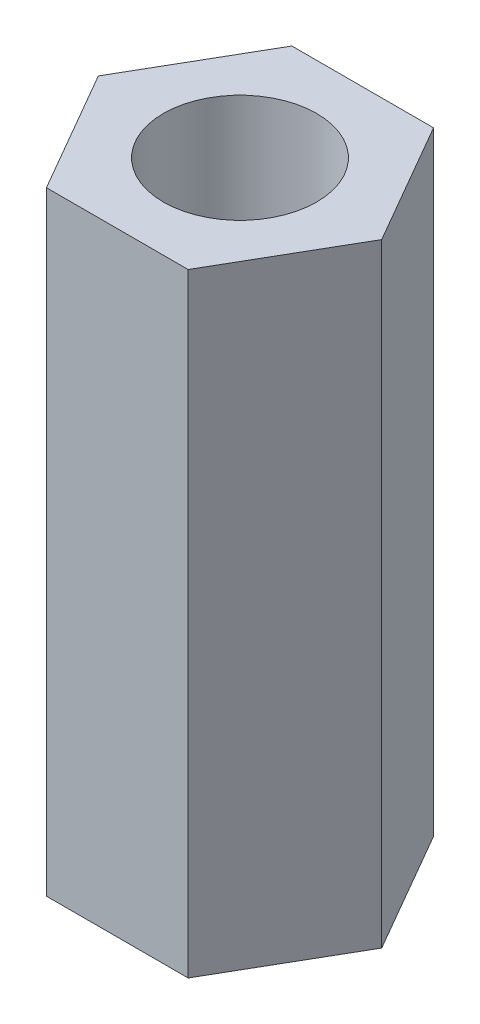
ISO-10303-21;
HEADER;
FILE_DESCRIPTION(('STEP AP214'),'2;1');
FILE_NAME('part.step','',(''),(''),'','','');
FILE_SCHEMA(('AUTOMOTIVE_DESIGN { 1 0 10303 214 1 1 1 1 }'));
ENDSEC;
DATA;
#1=APPLICATION_CONTEXT('core data for automotive mechanical design processes');
#2=APPLICATION_PROTOCOL_DEFINITION('international standard','automotive_design',2000,#1);
#3=PRODUCT_CONTEXT('',#1,'mechanical');
#4=PRODUCT('Part','Part','',(#3));
#5=PRODUCT_RELATED_PRODUCT_CATEGORY('part','',(#4));
#6=PRODUCT_DEFINITION_FORMATION('','',#4);
#7=PRODUCT_DEFINITION_CONTEXT('part definition',#1,'design');
#8=PRODUCT_DEFINITION('design','',#6,#7);
#9=PRODUCT_DEFINITION_SHAPE('','',#8);
#10=(LENGTH_UNIT() NAMED_UNIT(*) SI_UNIT(.MILLI.,.METRE.));
#11=(NAMED_UNIT(*) PLANE_ANGLE_UNIT() SI_UNIT($,.RADIAN.));
#12=(NAMED_UNIT(*) SI_UNIT($,.STERADIAN.) SOLID_ANGLE_UNIT());
#13=UNCERTAINTY_MEASURE_WITH_UNIT(LENGTH_MEASURE(1.E-05),#10,'distance_accuracy_value','');
#14=(GEOMETRIC_REPRESENTATION_CONTEXT(3) GLOBAL_UNCERTAINTY_ASSIGNED_CONTEXT((#13)) GLOBAL_UNIT_ASSIGNED_CONTEXT((#10,
#11,#12)) REPRESENTATION_CONTEXT('',''));
#15=CARTESIAN_POINT('',(0.,0.,0.));
#16=DIRECTION('',(0.,0.,1.));
#17=DIRECTION('',(1.,0.,0.));
#18=AXIS2_PLACEMENT_3D('',#15,#16,#17);
#19=CARTESIAN_POINT('',(1.15470053837928,10.,1.99999999999999));
#20=DIRECTION('',(-0.866025403784442,0.,-0.499999999999995));
#21=DIRECTION('',(-0.499999999999995,0.,0.866025403784442));
#22=AXIS2_PLACEMENT_3D('',#19,#20,#21);
#23=PLANE('',#22);
#24=DIRECTION('',(0.499999999999995,0.,-0.866025403784442));
#25=VECTOR('',#24,1.);
#26=CARTESIAN_POINT('',(1.15470053837928,0.,1.99999999999999));
#27=LINE('',#26,#25);
#28=CARTESIAN_POINT('',(1.15470053837928,0.,1.99999999999999));
#29=VERTEX_POINT('',#28);
#30=CARTESIAN_POINT('',(2.3094010767585,0.,0.));
#31=VERTEX_POINT('',#30);
#32=EDGE_CURVE('E123',#29,#31,#27,.T.);
#33=ORIENTED_EDGE('',*,*,#32,.T.);
#34=DIRECTION('',(0.,-1.,0.));
#35=VECTOR('',#34,1.);
#36=CARTESIAN_POINT('',(2.3094010767585,10.,0.));
#37=LINE('',#36,#35);
#38=CARTESIAN_POINT('',(2.3094010767585,10.,0.));
#39=VERTEX_POINT('',#38);
#40=EDGE_CURVE('E11',#39,#31,#37,.T.);
#41=ORIENTED_EDGE('',*,*,#40,.F.);
#42=DIRECTION('',(0.499999999999995,0.,-0.866025403784442));
#43=VECTOR('',#42,1.);
#44=CARTESIAN_POINT('',(1.15470053837928,10.,1.99999999999999));
#45=LINE('',#44,#43);
#46=CARTESIAN_POINT('',(1.15470053837928,10.,1.99999999999999));
#47=VERTEX_POINT('',#46);
#48=EDGE_CURVE('E134',#47,#39,#45,.T.);
#49=ORIENTED_EDGE('',*,*,#48,.F.);
#50=DIRECTION('',(0.,-1.,0.));
#51=VECTOR('',#50,1.);
#52=CARTESIAN_POINT('',(1.15470053837928,10.,1.99999999999999));
#53=LINE('',#52,#51);
#54=EDGE_CURVE('E119',#47,#29,#53,.T.);
#55=ORIENTED_EDGE('',*,*,#54,.T.);
#56=EDGE_LOOP('',(#33,#41,#49,#55));
#57=FACE_BOUND('',#56,.T.);
#58=ADVANCED_FACE('F39',(#57),#23,.F.);
#59=CARTESIAN_POINT('',(2.3094010767585,10.,0.));
#60=DIRECTION('',(-0.866025403784438,0.,0.500000000000001));
#61=DIRECTION('',(0.500000000000001,0.,0.866025403784438));
#62=AXIS2_PLACEMENT_3D('',#59,#60,#61);
#63=PLANE('',#62);
#64=DIRECTION('',(-0.500000000000001,0.,-0.866025403784438));
#65=VECTOR('',#64,1.);
#66=CARTESIAN_POINT('',(2.3094010767585,0.,0.));
#67=LINE('',#66,#65);
#68=CARTESIAN_POINT('',(1.15470053837925,0.,-2.));
#69=VERTEX_POINT('',#68);
#70=EDGE_CURVE('E126',#31,#69,#67,.T.);
#71=ORIENTED_EDGE('',*,*,#70,.T.);
#72=DIRECTION('',(0.,-1.,0.));
#73=VECTOR('',#72,1.);
#74=CARTESIAN_POINT('',(1.15470053837925,10.,-2.));
#75=LINE('',#74,#73);
#76=CARTESIAN_POINT('',(1.15470053837925,10.,-2.));
#77=VERTEX_POINT('',#76);
#78=EDGE_CURVE('E47',#77,#69,#75,.T.);
#79=ORIENTED_EDGE('',*,*,#78,.F.);
#80=DIRECTION('',(-0.500000000000001,0.,-0.866025403784438));
#81=VECTOR('',#80,1.);
#82=CARTESIAN_POINT('',(2.3094010767585,10.,0.));
#83=LINE('',#82,#81);
#84=EDGE_CURVE('E92',#39,#77,#83,.T.);
#85=ORIENTED_EDGE('',*,*,#84,.F.);
#86=ORIENTED_EDGE('',*,*,#40,.T.);
#87=EDGE_LOOP('',(#71,#79,#85,#86));
#88=FACE_BOUND('',#87,.T.);
#89=ADVANCED_FACE('F159',(#88),#63,.F.);
#90=CARTESIAN_POINT('',(1.15470053837925,10.,-2.));
#91=DIRECTION('',(0.,0.,1.));
#92=DIRECTION('',(1.,0.,0.));
#93=AXIS2_PLACEMENT_3D('',#90,#91,#92);
#94=PLANE('',#93);
#95=DIRECTION('',(-1.,0.,0.));
#96=VECTOR('',#95,1.);
#97=CARTESIAN_POINT('',(1.15470053837925,0.,-2.));
#98=LINE('',#97,#96);
#99=CARTESIAN_POINT('',(-1.15470053837926,0.,-2.));
#100=VERTEX_POINT('',#99);
#101=EDGE_CURVE('E129',#69,#100,#98,.T.);
#102=ORIENTED_EDGE('',*,*,#101,.T.);
#103=DIRECTION('',(0.,-1.,0.));
#104=VECTOR('',#103,1.);
#105=CARTESIAN_POINT('',(-1.15470053837926,10.,-2.));
#106=LINE('',#105,#104);
#107=CARTESIAN_POINT('',(-1.15470053837926,10.,-2.));
#108=VERTEX_POINT('',#107);
#109=EDGE_CURVE('E114',#108,#100,#106,.T.);
#110=ORIENTED_EDGE('',*,*,#109,.F.);
#111=DIRECTION('',(-1.,0.,0.));
#112=VECTOR('',#111,1.);
#113=CARTESIAN_POINT('',(1.15470053837925,10.,-2.));
#114=LINE('',#113,#112);
#115=EDGE_CURVE('E105',#77,#108,#114,.T.);
#116=ORIENTED_EDGE('',*,*,#115,.F.);
#117=ORIENTED_EDGE('',*,*,#78,.T.);
#118=EDGE_LOOP('',(#102,#110,#116,#117));
#119=FACE_BOUND('',#118,.T.);
#120=ADVANCED_FACE('F140',(#119),#94,.F.);
#121=CARTESIAN_POINT('',(-1.15470053837926,10.,-2.));
#122=DIRECTION('',(0.866025403784442,0.,0.499999999999995));
#123=DIRECTION('',(0.499999999999995,0.,-0.866025403784442));
#124=AXIS2_PLACEMENT_3D('',#121,#122,#123);
#125=PLANE('',#124);
#126=DIRECTION('',(-0.499999999999995,0.,0.866025403784442));
#127=VECTOR('',#126,1.);
#128=CARTESIAN_POINT('',(-1.15470053837926,0.,-2.));
#129=LINE('',#128,#127);
#130=CARTESIAN_POINT('',(-2.3094010767585,0.,0.));
#131=VERTEX_POINT('',#130);
#132=EDGE_CURVE('E113',#100,#131,#129,.T.);
#133=ORIENTED_EDGE('',*,*,#132,.T.);
#134=DIRECTION('',(0.,-1.,0.));
#135=VECTOR('',#134,1.);
#136=CARTESIAN_POINT('',(-2.3094010767585,10.,0.));
#137=LINE('',#136,#135);
#138=CARTESIAN_POINT('',(-2.3094010767585,10.,0.));
#139=VERTEX_POINT('',#138);
#140=EDGE_CURVE('E110',#139,#131,#137,.T.);
#141=ORIENTED_EDGE('',*,*,#140,.F.);
#142=DIRECTION('',(-0.499999999999995,0.,0.866025403784442));
#143=VECTOR('',#142,1.);
#144=CARTESIAN_POINT('',(-1.15470053837926,10.,-2.));
#145=LINE('',#144,#143);
#146=EDGE_CURVE('E99',#108,#139,#145,.T.);
#147=ORIENTED_EDGE('',*,*,#146,.F.);
#148=ORIENTED_EDGE('',*,*,#109,.T.);
#149=EDGE_LOOP('',(#133,#141,#147,#148));
#150=FACE_BOUND('',#149,.T.);
#151=ADVANCED_FACE('F111',(#150),#125,.F.);
#152=CARTESIAN_POINT('',(-2.3094010767585,10.,0.));
#153=DIRECTION('',(0.866025403784435,0.,-0.500000000000007));
#154=DIRECTION('',(-0.500000000000007,0.,-0.866025403784435));
#155=AXIS2_PLACEMENT_3D('',#152,#153,#154);
#156=PLANE('',#155);
#157=DIRECTION('',(0.500000000000007,0.,0.866025403784435));
#158=VECTOR('',#157,1.);
#159=CARTESIAN_POINT('',(-2.3094010767585,0.,0.));
#160=LINE('',#159,#158);
#161=CARTESIAN_POINT('',(-1.15470053837923,0.,2.00000000000001));
#162=VERTEX_POINT('',#161);
#163=EDGE_CURVE('E78',#131,#162,#160,.T.);
#164=ORIENTED_EDGE('',*,*,#163,.T.);
#165=DIRECTION('',(0.,-1.,0.));
#166=VECTOR('',#165,1.);
#167=CARTESIAN_POINT('',(-1.15470053837923,10.,2.00000000000001));
#168=LINE('',#167,#166);
#169=CARTESIAN_POINT('',(-1.15470053837923,10.,2.00000000000001));
#170=VERTEX_POINT('',#169);
#171=EDGE_CURVE('E115',#170,#162,#168,.T.);
#172=ORIENTED_EDGE('',*,*,#171,.F.);
#173=DIRECTION('',(0.500000000000007,0.,0.866025403784435));
#174=VECTOR('',#173,1.);
#175=CARTESIAN_POINT('',(-2.3094010767585,10.,0.));
#176=LINE('',#175,#174);
#177=EDGE_CURVE('E103',#139,#170,#176,.T.);
#178=ORIENTED_EDGE('',*,*,#177,.F.);
#179=ORIENTED_EDGE('',*,*,#140,.T.);
#180=EDGE_LOOP('',(#164,#172,#178,#179));
#181=FACE_BOUND('',#180,.T.);
#182=ADVANCED_FACE('F117',(#181),#156,.F.);
#183=CARTESIAN_POINT('',(-1.15470053837923,10.,2.00000000000001));
#184=DIRECTION('',(0.,0.,-1.));
#185=DIRECTION('',(-1.,0.,0.));
#186=AXIS2_PLACEMENT_3D('',#183,#184,#185);
#187=PLANE('',#186);
#188=DIRECTION('',(1.,0.,0.));
#189=VECTOR('',#188,1.);
#190=CARTESIAN_POINT('',(-1.15470053837923,0.,2.00000000000001));
#191=LINE('',#190,#189);
#192=EDGE_CURVE('E84',#162,#29,#191,.T.);
#193=ORIENTED_EDGE('',*,*,#192,.T.);
#194=ORIENTED_EDGE('',*,*,#54,.F.);
#195=DIRECTION('',(1.,0.,0.));
#196=VECTOR('',#195,1.);
#197=CARTESIAN_POINT('',(-1.15470053837923,10.,2.00000000000001));
#198=LINE('',#197,#196);
#199=EDGE_CURVE('E55',#170,#47,#198,.T.);
#200=ORIENTED_EDGE('',*,*,#199,.F.);
#201=ORIENTED_EDGE('',*,*,#171,.T.);
#202=EDGE_LOOP('',(#193,#194,#200,#201));
#203=FACE_BOUND('',#202,.T.);
#204=ADVANCED_FACE('F147',(#203),#187,.F.);
#205=CARTESIAN_POINT('',(0.,10.,0.));
#206=DIRECTION('',(0.,1.,0.));
#207=DIRECTION('',(0.,0.,1.));
#208=AXIS2_PLACEMENT_3D('',#205,#206,#207);
#209=PLANE('',#208);
#210=CARTESIAN_POINT('',(0.,10.,0.));
#211=DIRECTION('',(0.,1.,0.));
#212=DIRECTION('',(0.,0.,1.));
#213=AXIS2_PLACEMENT_3D('',#210,#211,#212);
#214=CIRCLE('',#213,1.25000000000001);
#215=CARTESIAN_POINT('',(0.,10.,1.25000000000001));
#216=VERTEX_POINT('',#215);
#217=EDGE_CURVE('E215',#216,#216,#214,.T.);
#218=ORIENTED_EDGE('',*,*,#217,.F.);
#219=EDGE_LOOP('',(#218));
#220=FACE_BOUND('',#219,.T.);
#221=ORIENTED_EDGE('',*,*,#48,.T.);
#222=ORIENTED_EDGE('',*,*,#84,.T.);
#223=ORIENTED_EDGE('',*,*,#115,.T.);
#224=ORIENTED_EDGE('',*,*,#146,.T.);
#225=ORIENTED_EDGE('',*,*,#177,.T.);
#226=ORIENTED_EDGE('',*,*,#199,.T.);
#227=EDGE_LOOP('',(#221,#222,#223,#224,#225,#226));
#228=FACE_BOUND('',#227,.T.);
#229=ADVANCED_FACE('F101',(#220,#228),#209,.T.);
#230=CARTESIAN_POINT('',(0.,0.,0.));
#231=DIRECTION('',(0.,1.,0.));
#232=DIRECTION('',(0.,0.,1.));
#233=AXIS2_PLACEMENT_3D('',#230,#231,#232);
#234=PLANE('',#233);
#235=CARTESIAN_POINT('',(0.,0.,0.));
#236=DIRECTION('',(0.,1.,0.));
#237=DIRECTION('',(0.,0.,1.));
#238=AXIS2_PLACEMENT_3D('',#235,#236,#237);
#239=CIRCLE('',#238,1.25000000000001);
#240=CARTESIAN_POINT('',(0.,0.,1.25000000000001));
#241=VERTEX_POINT('',#240);
#242=EDGE_CURVE('E127',#241,#241,#239,.T.);
#243=ORIENTED_EDGE('',*,*,#242,.T.);
#244=EDGE_LOOP('',(#243));
#245=FACE_BOUND('',#244,.T.);
#246=ORIENTED_EDGE('',*,*,#32,.F.);
#247=ORIENTED_EDGE('',*,*,#192,.F.);
#248=ORIENTED_EDGE('',*,*,#163,.F.);
#249=ORIENTED_EDGE('',*,*,#132,.F.);
#250=ORIENTED_EDGE('',*,*,#101,.F.);
#251=ORIENTED_EDGE('',*,*,#70,.F.);
#252=EDGE_LOOP('',(#246,#247,#248,#249,#250,#251));
#253=FACE_BOUND('',#252,.T.);
#254=ADVANCED_FACE('F143',(#245,#253),#234,.F.);
#255=CARTESIAN_POINT('',(0.,10.,0.));
#256=DIRECTION('',(0.,1.,0.));
#257=DIRECTION('',(0.,0.,1.));
#258=AXIS2_PLACEMENT_3D('',#255,#256,#257);
#259=CYLINDRICAL_SURFACE('',#258,1.25000000000001);
#260=ORIENTED_EDGE('',*,*,#242,.F.);
#261=EDGE_LOOP('',(#260));
#262=FACE_BOUND('',#261,.T.);
#263=ORIENTED_EDGE('',*,*,#217,.T.);
#264=EDGE_LOOP('',(#263));
#265=FACE_BOUND('',#264,.T.);
#266=ADVANCED_FACE('F198',(#262,#265),#259,.F.);
#267=CLOSED_SHELL('',(#58,#89,#120,#151,#182,#204,#229,#254,#266));
#268=MANIFOLD_SOLID_BREP('B2',#267);
#269=ADVANCED_BREP_SHAPE_REPRESENTATION('',(#18,#268),#14);
#270=SHAPE_DEFINITION_REPRESENTATION(#9,#269);
ENDSEC;
END-ISO-10303-21;
